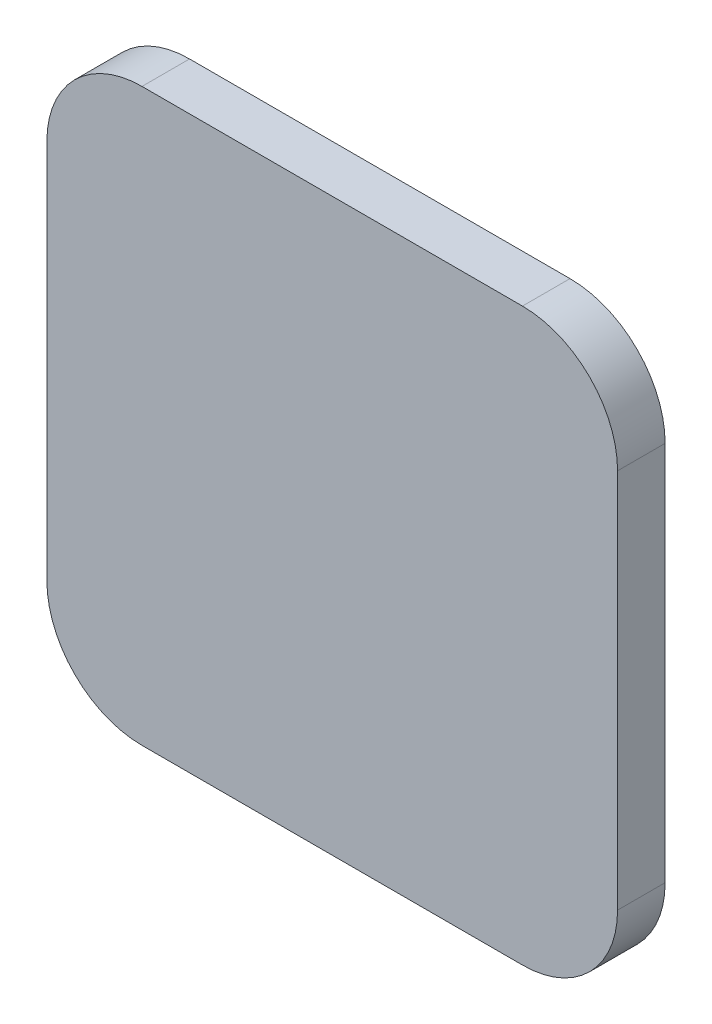
ISO-10303-21;
HEADER;
FILE_DESCRIPTION(('STEP AP214'),'2;1');
FILE_NAME('part.step','',(''),(''),'','','');
FILE_SCHEMA(('AUTOMOTIVE_DESIGN { 1 0 10303 214 1 1 1 1 }'));
ENDSEC;
DATA;
#1=APPLICATION_CONTEXT('core data for automotive mechanical design processes');
#2=APPLICATION_PROTOCOL_DEFINITION('international standard','automotive_design',2000,#1);
#3=PRODUCT_CONTEXT('',#1,'mechanical');
#4=PRODUCT('Part','Part','',(#3));
#5=PRODUCT_RELATED_PRODUCT_CATEGORY('part','',(#4));
#6=PRODUCT_DEFINITION_FORMATION('','',#4);
#7=PRODUCT_DEFINITION_CONTEXT('part definition',#1,'design');
#8=PRODUCT_DEFINITION('design','',#6,#7);
#9=PRODUCT_DEFINITION_SHAPE('','',#8);
#10=(LENGTH_UNIT() NAMED_UNIT(*) SI_UNIT(.MILLI.,.METRE.));
#11=(NAMED_UNIT(*) PLANE_ANGLE_UNIT() SI_UNIT($,.RADIAN.));
#12=(NAMED_UNIT(*) SI_UNIT($,.STERADIAN.) SOLID_ANGLE_UNIT());
#13=UNCERTAINTY_MEASURE_WITH_UNIT(LENGTH_MEASURE(1.E-05),#10,'distance_accuracy_value','');
#14=(GEOMETRIC_REPRESENTATION_CONTEXT(3) GLOBAL_UNCERTAINTY_ASSIGNED_CONTEXT((#13)) GLOBAL_UNIT_ASSIGNED_CONTEXT((#10,
#11,#12)) REPRESENTATION_CONTEXT('',''));
#15=CARTESIAN_POINT('',(0.,0.,0.));
#16=DIRECTION('',(0.,0.,1.));
#17=DIRECTION('',(1.,0.,0.));
#18=AXIS2_PLACEMENT_3D('',#15,#16,#17);
#19=CARTESIAN_POINT('',(0.,0.,0.));
#20=DIRECTION('',(0.,0.,1.));
#21=DIRECTION('',(1.,0.,0.));
#22=AXIS2_PLACEMENT_3D('',#19,#20,#21);
#23=PLANE('',#22);
#24=CARTESIAN_POINT('',(0.,0.,0.));
#25=DIRECTION('',(0.,0.,1.));
#26=DIRECTION('',(1.,0.,0.));
#27=AXIS2_PLACEMENT_3D('',#24,#25,#26);
#28=CIRCLE('',#27,7.5);
#29=CARTESIAN_POINT('',(7.5,0.,0.));
#30=VERTEX_POINT('',#29);
#31=EDGE_CURVE('E165',#30,#30,#28,.T.);
#32=ORIENTED_EDGE('',*,*,#31,.F.);
#33=EDGE_LOOP('',(#32));
#34=FACE_BOUND('',#33,.T.);
#35=CARTESIAN_POINT('',(0.,0.,0.));
#36=DIRECTION('',(0.,0.,1.));
#37=DIRECTION('',(1.,0.,0.));
#38=AXIS2_PLACEMENT_3D('',#35,#36,#37);
#39=CIRCLE('',#38,5.);
#40=CARTESIAN_POINT('',(5.,0.,0.));
#41=VERTEX_POINT('',#40);
#42=EDGE_CURVE('E161',#41,#41,#39,.T.);
#43=ORIENTED_EDGE('',*,*,#42,.T.);
#44=EDGE_LOOP('',(#43));
#45=FACE_BOUND('',#44,.T.);
#46=ADVANCED_FACE('F45',(#34,#45),#23,.F.);
#47=CARTESIAN_POINT('',(0.,0.,5.));
#48=DIRECTION('',(0.,0.,-1.));
#49=DIRECTION('',(-1.,0.,0.));
#50=AXIS2_PLACEMENT_3D('',#47,#48,#49);
#51=CYLINDRICAL_SURFACE('',#50,7.5);
#52=CARTESIAN_POINT('',(0.,0.,3.7));
#53=DIRECTION('',(0.,0.,-1.));
#54=DIRECTION('',(-1.,0.,0.));
#55=AXIS2_PLACEMENT_3D('',#52,#53,#54);
#56=CIRCLE('',#55,7.5);
#57=CARTESIAN_POINT('',(-7.5,0.,3.7));
#58=VERTEX_POINT('',#57);
#59=EDGE_CURVE('E12',#58,#58,#56,.T.);
#60=ORIENTED_EDGE('',*,*,#59,.T.);
#61=EDGE_LOOP('',(#60));
#62=FACE_BOUND('',#61,.T.);
#63=ORIENTED_EDGE('',*,*,#31,.T.);
#64=EDGE_LOOP('',(#63));
#65=FACE_BOUND('',#64,.T.);
#66=ADVANCED_FACE('F221',(#62,#65),#51,.T.);
#67=CARTESIAN_POINT('',(0.,0.,5.));
#68=DIRECTION('',(0.,0.,-1.));
#69=DIRECTION('',(-1.,0.,0.));
#70=AXIS2_PLACEMENT_3D('',#67,#68,#69);
#71=CYLINDRICAL_SURFACE('',#70,5.);
#72=CARTESIAN_POINT('',(0.,0.,5.));
#73=DIRECTION('',(0.,0.,1.));
#74=DIRECTION('',(1.,0.,0.));
#75=AXIS2_PLACEMENT_3D('',#72,#73,#74);
#76=CIRCLE('',#75,5.);
#77=CARTESIAN_POINT('',(5.,0.,5.));
#78=VERTEX_POINT('',#77);
#79=EDGE_CURVE('E157',#78,#78,#76,.T.);
#80=ORIENTED_EDGE('',*,*,#79,.T.);
#81=EDGE_LOOP('',(#80));
#82=FACE_BOUND('',#81,.T.);
#83=ORIENTED_EDGE('',*,*,#42,.F.);
#84=EDGE_LOOP('',(#83));
#85=FACE_BOUND('',#84,.T.);
#86=ADVANCED_FACE('F227',(#82,#85),#71,.F.);
#87=CARTESIAN_POINT('',(0.,0.,5.));
#88=DIRECTION('',(0.,0.,-1.));
#89=DIRECTION('',(-1.,0.,0.));
#90=AXIS2_PLACEMENT_3D('',#87,#88,#89);
#91=PLANE('',#90);
#92=ORIENTED_EDGE('',*,*,#79,.F.);
#93=EDGE_LOOP('',(#92));
#94=FACE_BOUND('',#93,.T.);
#95=ADVANCED_FACE('F276',(#94),#91,.T.);
#96=CARTESIAN_POINT('',(15.,-15.,7.5));
#97=DIRECTION('',(-1.,0.,0.));
#98=DIRECTION('',(0.,0.,1.));
#99=AXIS2_PLACEMENT_3D('',#96,#97,#98);
#100=PLANE('',#99);
#101=DIRECTION('',(0.,1.,0.));
#102=VECTOR('',#101,1.);
#103=CARTESIAN_POINT('',(15.,-15.,7.5));
#104=LINE('',#103,#102);
#105=CARTESIAN_POINT('',(15.,-10.,7.5));
#106=VERTEX_POINT('',#105);
#107=CARTESIAN_POINT('',(15.,10.,7.5));
#108=VERTEX_POINT('',#107);
#109=EDGE_CURVE('E134',#106,#108,#104,.T.);
#110=ORIENTED_EDGE('',*,*,#109,.F.);
#111=DIRECTION('',(0.,0.,-1.));
#112=VECTOR('',#111,1.);
#113=CARTESIAN_POINT('',(15.,-10.,7.5));
#114=LINE('',#113,#112);
#115=CARTESIAN_POINT('',(15.,-10.,5.));
#116=VERTEX_POINT('',#115);
#117=EDGE_CURVE('E117',#106,#116,#114,.T.);
#118=ORIENTED_EDGE('',*,*,#117,.T.);
#119=DIRECTION('',(0.,1.,0.));
#120=VECTOR('',#119,1.);
#121=CARTESIAN_POINT('',(15.,-15.,5.));
#122=LINE('',#121,#120);
#123=CARTESIAN_POINT('',(15.,10.,5.));
#124=VERTEX_POINT('',#123);
#125=EDGE_CURVE('E131',#116,#124,#122,.T.);
#126=ORIENTED_EDGE('',*,*,#125,.T.);
#127=DIRECTION('',(0.,0.,-1.));
#128=VECTOR('',#127,1.);
#129=CARTESIAN_POINT('',(15.,10.,7.5));
#130=LINE('',#129,#128);
#131=EDGE_CURVE('E137',#124,#108,#130,.F.);
#132=ORIENTED_EDGE('',*,*,#131,.T.);
#133=EDGE_LOOP('',(#110,#118,#126,#132));
#134=FACE_BOUND('',#133,.T.);
#135=ADVANCED_FACE('F130',(#134),#100,.F.);
#136=CARTESIAN_POINT('',(-15.,15.,7.5));
#137=DIRECTION('',(0.,-1.,0.));
#138=DIRECTION('',(0.,0.,-1.));
#139=AXIS2_PLACEMENT_3D('',#136,#137,#138);
#140=PLANE('',#139);
#141=DIRECTION('',(-1.,0.,0.));
#142=VECTOR('',#141,1.);
#143=CARTESIAN_POINT('',(-15.,15.,7.5));
#144=LINE('',#143,#142);
#145=CARTESIAN_POINT('',(10.,15.,7.5));
#146=VERTEX_POINT('',#145);
#147=CARTESIAN_POINT('',(-10.,15.,7.5));
#148=VERTEX_POINT('',#147);
#149=EDGE_CURVE('E258',#146,#148,#144,.T.);
#150=ORIENTED_EDGE('',*,*,#149,.F.);
#151=DIRECTION('',(0.,0.,-1.));
#152=VECTOR('',#151,1.);
#153=CARTESIAN_POINT('',(10.,15.,7.5));
#154=LINE('',#153,#152);
#155=CARTESIAN_POINT('',(10.,15.,5.));
#156=VERTEX_POINT('',#155);
#157=EDGE_CURVE('E197',#146,#156,#154,.T.);
#158=ORIENTED_EDGE('',*,*,#157,.T.);
#159=DIRECTION('',(-1.,0.,0.));
#160=VECTOR('',#159,1.);
#161=CARTESIAN_POINT('',(-15.,15.,5.));
#162=LINE('',#161,#160);
#163=CARTESIAN_POINT('',(-10.,15.,5.));
#164=VERTEX_POINT('',#163);
#165=EDGE_CURVE('E142',#156,#164,#162,.T.);
#166=ORIENTED_EDGE('',*,*,#165,.T.);
#167=DIRECTION('',(0.,0.,-1.));
#168=VECTOR('',#167,1.);
#169=CARTESIAN_POINT('',(-10.,15.,7.5));
#170=LINE('',#169,#168);
#171=EDGE_CURVE('E194',#164,#148,#170,.F.);
#172=ORIENTED_EDGE('',*,*,#171,.T.);
#173=EDGE_LOOP('',(#150,#158,#166,#172));
#174=FACE_BOUND('',#173,.T.);
#175=ADVANCED_FACE('F268',(#174),#140,.F.);
#176=CARTESIAN_POINT('',(-15.,-15.,7.5));
#177=DIRECTION('',(1.,0.,0.));
#178=DIRECTION('',(0.,0.,-1.));
#179=AXIS2_PLACEMENT_3D('',#176,#177,#178);
#180=PLANE('',#179);
#181=DIRECTION('',(0.,-1.,0.));
#182=VECTOR('',#181,1.);
#183=CARTESIAN_POINT('',(-15.,-15.,7.5));
#184=LINE('',#183,#182);
#185=CARTESIAN_POINT('',(-15.,10.,7.5));
#186=VERTEX_POINT('',#185);
#187=CARTESIAN_POINT('',(-15.,-10.,7.5));
#188=VERTEX_POINT('',#187);
#189=EDGE_CURVE('E249',#186,#188,#184,.T.);
#190=ORIENTED_EDGE('',*,*,#189,.F.);
#191=DIRECTION('',(0.,0.,-1.));
#192=VECTOR('',#191,1.);
#193=CARTESIAN_POINT('',(-15.,10.,7.5));
#194=LINE('',#193,#192);
#195=CARTESIAN_POINT('',(-15.,10.,5.));
#196=VERTEX_POINT('',#195);
#197=EDGE_CURVE('E203',#186,#196,#194,.T.);
#198=ORIENTED_EDGE('',*,*,#197,.T.);
#199=DIRECTION('',(0.,-1.,0.));
#200=VECTOR('',#199,1.);
#201=CARTESIAN_POINT('',(-15.,-15.,5.));
#202=LINE('',#201,#200);
#203=CARTESIAN_POINT('',(-15.,-10.,5.));
#204=VERTEX_POINT('',#203);
#205=EDGE_CURVE('E146',#196,#204,#202,.T.);
#206=ORIENTED_EDGE('',*,*,#205,.T.);
#207=DIRECTION('',(0.,0.,-1.));
#208=VECTOR('',#207,1.);
#209=CARTESIAN_POINT('',(-15.,-10.,7.5));
#210=LINE('',#209,#208);
#211=EDGE_CURVE('E61',#204,#188,#210,.F.);
#212=ORIENTED_EDGE('',*,*,#211,.T.);
#213=EDGE_LOOP('',(#190,#198,#206,#212));
#214=FACE_BOUND('',#213,.T.);
#215=ADVANCED_FACE('F248',(#214),#180,.F.);
#216=CARTESIAN_POINT('',(-15.,-15.,7.5));
#217=DIRECTION('',(0.,1.,0.));
#218=DIRECTION('',(0.,0.,1.));
#219=AXIS2_PLACEMENT_3D('',#216,#217,#218);
#220=PLANE('',#219);
#221=DIRECTION('',(1.,0.,0.));
#222=VECTOR('',#221,1.);
#223=CARTESIAN_POINT('',(-15.,-15.,5.));
#224=LINE('',#223,#222);
#225=CARTESIAN_POINT('',(-10.,-15.,5.));
#226=VERTEX_POINT('',#225);
#227=CARTESIAN_POINT('',(10.,-15.,5.));
#228=VERTEX_POINT('',#227);
#229=EDGE_CURVE('E154',#226,#228,#224,.T.);
#230=ORIENTED_EDGE('',*,*,#229,.T.);
#231=DIRECTION('',(0.,0.,-1.));
#232=VECTOR('',#231,1.);
#233=CARTESIAN_POINT('',(10.,-15.,7.5));
#234=LINE('',#233,#232);
#235=CARTESIAN_POINT('',(10.,-15.,7.5));
#236=VERTEX_POINT('',#235);
#237=EDGE_CURVE('E118',#228,#236,#234,.F.);
#238=ORIENTED_EDGE('',*,*,#237,.T.);
#239=DIRECTION('',(1.,0.,0.));
#240=VECTOR('',#239,1.);
#241=CARTESIAN_POINT('',(-15.,-15.,7.5));
#242=LINE('',#241,#240);
#243=CARTESIAN_POINT('',(-10.,-15.,7.5));
#244=VERTEX_POINT('',#243);
#245=EDGE_CURVE('E149',#244,#236,#242,.T.);
#246=ORIENTED_EDGE('',*,*,#245,.F.);
#247=DIRECTION('',(0.,0.,-1.));
#248=VECTOR('',#247,1.);
#249=CARTESIAN_POINT('',(-10.,-15.,7.5));
#250=LINE('',#249,#248);
#251=EDGE_CURVE('E124',#244,#226,#250,.T.);
#252=ORIENTED_EDGE('',*,*,#251,.T.);
#253=EDGE_LOOP('',(#230,#238,#246,#252));
#254=FACE_BOUND('',#253,.T.);
#255=ADVANCED_FACE('F254',(#254),#220,.F.);
#256=CARTESIAN_POINT('',(0.,0.,7.5));
#257=DIRECTION('',(0.,0.,-1.));
#258=DIRECTION('',(-1.,0.,0.));
#259=AXIS2_PLACEMENT_3D('',#256,#257,#258);
#260=PLANE('',#259);
#261=ORIENTED_EDGE('',*,*,#245,.T.);
#262=CARTESIAN_POINT('',(10.,-10.,7.5));
#263=DIRECTION('',(0.,0.,-1.));
#264=DIRECTION('',(-1.,0.,0.));
#265=AXIS2_PLACEMENT_3D('',#262,#263,#264);
#266=CIRCLE('',#265,5.);
#267=EDGE_CURVE('E191',#236,#106,#266,.F.);
#268=ORIENTED_EDGE('',*,*,#267,.T.);
#269=ORIENTED_EDGE('',*,*,#109,.T.);
#270=CARTESIAN_POINT('',(10.,10.,7.5));
#271=DIRECTION('',(0.,0.,-1.));
#272=DIRECTION('',(-1.,0.,0.));
#273=AXIS2_PLACEMENT_3D('',#270,#271,#272);
#274=CIRCLE('',#273,5.);
#275=EDGE_CURVE('E188',#108,#146,#274,.F.);
#276=ORIENTED_EDGE('',*,*,#275,.T.);
#277=ORIENTED_EDGE('',*,*,#149,.T.);
#278=CARTESIAN_POINT('',(-10.,10.,7.5));
#279=DIRECTION('',(0.,0.,-1.));
#280=DIRECTION('',(-1.,0.,0.));
#281=AXIS2_PLACEMENT_3D('',#278,#279,#280);
#282=CIRCLE('',#281,5.);
#283=EDGE_CURVE('E68',#148,#186,#282,.F.);
#284=ORIENTED_EDGE('',*,*,#283,.T.);
#285=ORIENTED_EDGE('',*,*,#189,.T.);
#286=CARTESIAN_POINT('',(-10.,-10.,7.5));
#287=DIRECTION('',(0.,0.,-1.));
#288=DIRECTION('',(-1.,0.,0.));
#289=AXIS2_PLACEMENT_3D('',#286,#287,#288);
#290=CIRCLE('',#289,5.);
#291=EDGE_CURVE('E183',#188,#244,#290,.F.);
#292=ORIENTED_EDGE('',*,*,#291,.T.);
#293=EDGE_LOOP('',(#261,#268,#269,#276,#277,#284,#285,#292));
#294=FACE_BOUND('',#293,.T.);
#295=ADVANCED_FACE('F264',(#294),#260,.F.);
#296=CARTESIAN_POINT('',(0.,0.,5.));
#297=DIRECTION('',(0.,0.,-1.));
#298=DIRECTION('',(-1.,0.,0.));
#299=AXIS2_PLACEMENT_3D('',#296,#297,#298);
#300=CIRCLE('',#299,8.8);
#301=CARTESIAN_POINT('',(-8.8,0.,5.));
#302=VERTEX_POINT('',#301);
#303=EDGE_CURVE('E54',#302,#302,#300,.F.);
#304=ORIENTED_EDGE('',*,*,#303,.T.);
#305=EDGE_LOOP('',(#304));
#306=FACE_BOUND('',#305,.T.);
#307=ORIENTED_EDGE('',*,*,#125,.F.);
#308=CARTESIAN_POINT('',(10.,-10.,5.));
#309=DIRECTION('',(0.,0.,-1.));
#310=DIRECTION('',(-1.,0.,0.));
#311=AXIS2_PLACEMENT_3D('',#308,#309,#310);
#312=CIRCLE('',#311,5.);
#313=EDGE_CURVE('E113',#116,#228,#312,.T.);
#314=ORIENTED_EDGE('',*,*,#313,.T.);
#315=ORIENTED_EDGE('',*,*,#229,.F.);
#316=CARTESIAN_POINT('',(-10.,-10.,5.));
#317=DIRECTION('',(0.,0.,-1.));
#318=DIRECTION('',(-1.,0.,0.));
#319=AXIS2_PLACEMENT_3D('',#316,#317,#318);
#320=CIRCLE('',#319,5.);
#321=EDGE_CURVE('E136',#226,#204,#320,.T.);
#322=ORIENTED_EDGE('',*,*,#321,.T.);
#323=ORIENTED_EDGE('',*,*,#205,.F.);
#324=CARTESIAN_POINT('',(-10.,10.,5.));
#325=DIRECTION('',(0.,0.,-1.));
#326=DIRECTION('',(-1.,0.,0.));
#327=AXIS2_PLACEMENT_3D('',#324,#325,#326);
#328=CIRCLE('',#327,5.);
#329=EDGE_CURVE('E173',#196,#164,#328,.T.);
#330=ORIENTED_EDGE('',*,*,#329,.T.);
#331=ORIENTED_EDGE('',*,*,#165,.F.);
#332=CARTESIAN_POINT('',(10.,10.,5.));
#333=DIRECTION('',(0.,0.,-1.));
#334=DIRECTION('',(-1.,0.,0.));
#335=AXIS2_PLACEMENT_3D('',#332,#333,#334);
#336=CIRCLE('',#335,5.);
#337=EDGE_CURVE('E125',#156,#124,#336,.T.);
#338=ORIENTED_EDGE('',*,*,#337,.T.);
#339=EDGE_LOOP('',(#307,#314,#315,#322,#323,#330,#331,#338));
#340=FACE_BOUND('',#339,.T.);
#341=ADVANCED_FACE('F139',(#306,#340),#91,.T.);
#342=CARTESIAN_POINT('',(10.,-10.,7.5));
#343=DIRECTION('',(0.,0.,-1.));
#344=DIRECTION('',(-1.,0.,0.));
#345=AXIS2_PLACEMENT_3D('',#342,#343,#344);
#346=CYLINDRICAL_SURFACE('',#345,5.);
#347=ORIENTED_EDGE('',*,*,#267,.F.);
#348=ORIENTED_EDGE('',*,*,#237,.F.);
#349=ORIENTED_EDGE('',*,*,#313,.F.);
#350=ORIENTED_EDGE('',*,*,#117,.F.);
#351=EDGE_LOOP('',(#347,#348,#349,#350));
#352=FACE_BOUND('',#351,.T.);
#353=ADVANCED_FACE('F116',(#352),#346,.T.);
#354=CARTESIAN_POINT('',(10.,10.,7.5));
#355=DIRECTION('',(0.,0.,-1.));
#356=DIRECTION('',(-1.,0.,0.));
#357=AXIS2_PLACEMENT_3D('',#354,#355,#356);
#358=CYLINDRICAL_SURFACE('',#357,5.);
#359=ORIENTED_EDGE('',*,*,#275,.F.);
#360=ORIENTED_EDGE('',*,*,#131,.F.);
#361=ORIENTED_EDGE('',*,*,#337,.F.);
#362=ORIENTED_EDGE('',*,*,#157,.F.);
#363=EDGE_LOOP('',(#359,#360,#361,#362));
#364=FACE_BOUND('',#363,.T.);
#365=ADVANCED_FACE('F237',(#364),#358,.T.);
#366=CARTESIAN_POINT('',(-10.,10.,7.5));
#367=DIRECTION('',(0.,0.,-1.));
#368=DIRECTION('',(-1.,0.,0.));
#369=AXIS2_PLACEMENT_3D('',#366,#367,#368);
#370=CYLINDRICAL_SURFACE('',#369,5.);
#371=ORIENTED_EDGE('',*,*,#283,.F.);
#372=ORIENTED_EDGE('',*,*,#171,.F.);
#373=ORIENTED_EDGE('',*,*,#329,.F.);
#374=ORIENTED_EDGE('',*,*,#197,.F.);
#375=EDGE_LOOP('',(#371,#372,#373,#374));
#376=FACE_BOUND('',#375,.T.);
#377=ADVANCED_FACE('F217',(#376),#370,.T.);
#378=CARTESIAN_POINT('',(-10.,-10.,7.5));
#379=DIRECTION('',(0.,0.,-1.));
#380=DIRECTION('',(-1.,0.,0.));
#381=AXIS2_PLACEMENT_3D('',#378,#379,#380);
#382=CYLINDRICAL_SURFACE('',#381,5.);
#383=ORIENTED_EDGE('',*,*,#291,.F.);
#384=ORIENTED_EDGE('',*,*,#211,.F.);
#385=ORIENTED_EDGE('',*,*,#321,.F.);
#386=ORIENTED_EDGE('',*,*,#251,.F.);
#387=EDGE_LOOP('',(#383,#384,#385,#386));
#388=FACE_BOUND('',#387,.T.);
#389=ADVANCED_FACE('F212',(#388),#382,.T.);
#390=CARTESIAN_POINT('',(0.,0.,3.7));
#391=DIRECTION('',(0.,0.,-1.));
#392=DIRECTION('',(-1.,0.,0.));
#393=AXIS2_PLACEMENT_3D('',#390,#391,#392);
#394=TOROIDAL_SURFACE('',#393,8.8,1.3);
#395=ORIENTED_EDGE('',*,*,#59,.F.);
#396=EDGE_LOOP('',(#395));
#397=FACE_BOUND('',#396,.T.);
#398=ORIENTED_EDGE('',*,*,#303,.F.);
#399=EDGE_LOOP('',(#398));
#400=FACE_BOUND('',#399,.T.);
#401=ADVANCED_FACE('F47',(#397,#400),#394,.F.);
#402=CLOSED_SHELL('',(#46,#66,#86,#95,#135,#175,#215,#255,#295,#341,#353,#365,#377,#389,#401));
#403=MANIFOLD_SOLID_BREP('B2',#402);
#404=ADVANCED_BREP_SHAPE_REPRESENTATION('',(#18,#403),#14);
#405=SHAPE_DEFINITION_REPRESENTATION(#9,#404);
ENDSEC;
END-ISO-10303-21;
